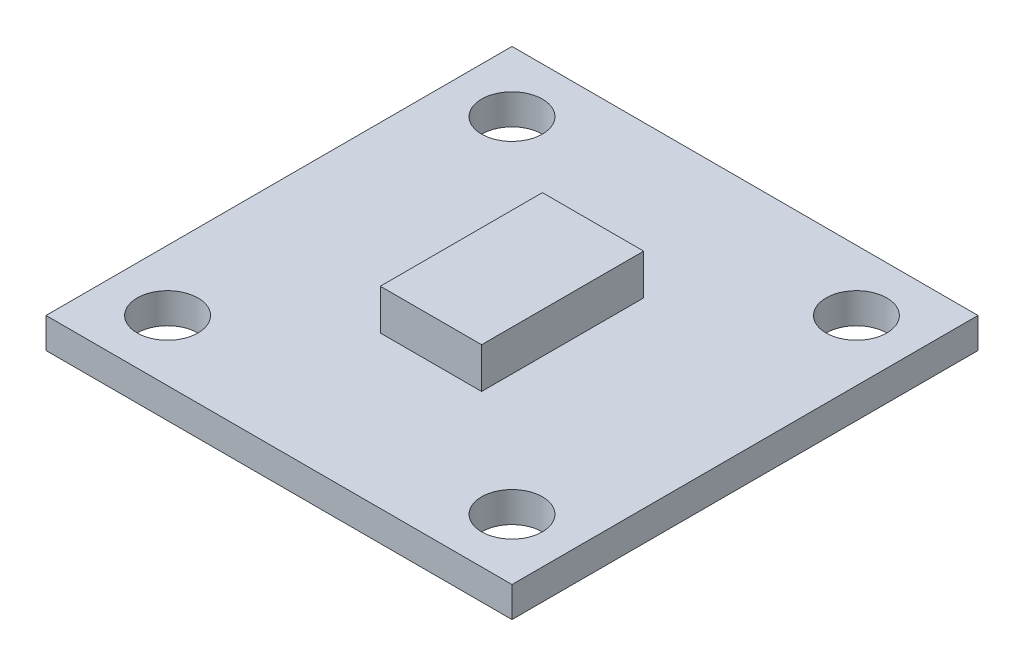
ISO-10303-21;
HEADER;
FILE_DESCRIPTION(('STEP AP214'),'2;1');
FILE_NAME('part.step','',(''),(''),'','','');
FILE_SCHEMA(('AUTOMOTIVE_DESIGN { 1 0 10303 214 1 1 1 1 }'));
ENDSEC;
DATA;
#1=APPLICATION_CONTEXT('core data for automotive mechanical design processes');
#2=APPLICATION_PROTOCOL_DEFINITION('international standard','automotive_design',2000,#1);
#3=PRODUCT_CONTEXT('',#1,'mechanical');
#4=PRODUCT('Part','Part','',(#3));
#5=PRODUCT_RELATED_PRODUCT_CATEGORY('part','',(#4));
#6=PRODUCT_DEFINITION_FORMATION('','',#4);
#7=PRODUCT_DEFINITION_CONTEXT('part definition',#1,'design');
#8=PRODUCT_DEFINITION('design','',#6,#7);
#9=PRODUCT_DEFINITION_SHAPE('','',#8);
#10=(LENGTH_UNIT() NAMED_UNIT(*) SI_UNIT(.MILLI.,.METRE.));
#11=(NAMED_UNIT(*) PLANE_ANGLE_UNIT() SI_UNIT($,.RADIAN.));
#12=(NAMED_UNIT(*) SI_UNIT($,.STERADIAN.) SOLID_ANGLE_UNIT());
#13=UNCERTAINTY_MEASURE_WITH_UNIT(LENGTH_MEASURE(1.E-05),#10,'distance_accuracy_value','');
#14=(GEOMETRIC_REPRESENTATION_CONTEXT(3) GLOBAL_UNCERTAINTY_ASSIGNED_CONTEXT((#13)) GLOBAL_UNIT_ASSIGNED_CONTEXT((#10,
#11,#12)) REPRESENTATION_CONTEXT('',''));
#15=CARTESIAN_POINT('',(0.,0.,0.));
#16=DIRECTION('',(0.,0.,1.));
#17=DIRECTION('',(1.,0.,0.));
#18=AXIS2_PLACEMENT_3D('',#15,#16,#17);
#19=CARTESIAN_POINT('',(0.,1.5,0.));
#20=DIRECTION('',(0.,1.,0.));
#21=DIRECTION('',(0.,0.,1.));
#22=AXIS2_PLACEMENT_3D('',#19,#20,#21);
#23=PLANE('',#22);
#24=CARTESIAN_POINT('',(-8.5,1.5,8.5));
#25=DIRECTION('',(0.,1.,0.));
#26=DIRECTION('',(0.,0.,1.));
#27=AXIS2_PLACEMENT_3D('',#24,#25,#26);
#28=CIRCLE('',#27,1.5);
#29=CARTESIAN_POINT('',(-8.5,1.5,10.));
#30=VERTEX_POINT('',#29);
#31=EDGE_CURVE('E143',#30,#30,#28,.T.);
#32=ORIENTED_EDGE('',*,*,#31,.F.);
#33=EDGE_LOOP('',(#32));
#34=FACE_BOUND('',#33,.T.);
#35=CARTESIAN_POINT('',(8.5,1.5,-8.5));
#36=DIRECTION('',(0.,1.,0.));
#37=DIRECTION('',(0.,0.,1.));
#38=AXIS2_PLACEMENT_3D('',#35,#36,#37);
#39=CIRCLE('',#38,1.5);
#40=CARTESIAN_POINT('',(8.5,1.5,-7.));
#41=VERTEX_POINT('',#40);
#42=EDGE_CURVE('E155',#41,#41,#39,.T.);
#43=ORIENTED_EDGE('',*,*,#42,.F.);
#44=EDGE_LOOP('',(#43));
#45=FACE_BOUND('',#44,.T.);
#46=DIRECTION('',(0.,0.,-1.));
#47=VECTOR('',#46,1.);
#48=CARTESIAN_POINT('',(11.5,1.5,-11.5));
#49=LINE('',#48,#47);
#50=CARTESIAN_POINT('',(11.5,1.5,11.5));
#51=VERTEX_POINT('',#50);
#52=CARTESIAN_POINT('',(11.5,1.5,-11.5));
#53=VERTEX_POINT('',#52);
#54=EDGE_CURVE('E161',#51,#53,#49,.T.);
#55=ORIENTED_EDGE('',*,*,#54,.T.);
#56=DIRECTION('',(-1.,0.,0.));
#57=VECTOR('',#56,1.);
#58=CARTESIAN_POINT('',(-11.5,1.5,-11.5));
#59=LINE('',#58,#57);
#60=CARTESIAN_POINT('',(-11.5,1.5,-11.5));
#61=VERTEX_POINT('',#60);
#62=EDGE_CURVE('E85',#53,#61,#59,.T.);
#63=ORIENTED_EDGE('',*,*,#62,.T.);
#64=DIRECTION('',(0.,0.,1.));
#65=VECTOR('',#64,1.);
#66=CARTESIAN_POINT('',(-11.5,1.5,-11.5));
#67=LINE('',#66,#65);
#68=CARTESIAN_POINT('',(-11.5,1.5,11.5));
#69=VERTEX_POINT('',#68);
#70=EDGE_CURVE('E164',#61,#69,#67,.T.);
#71=ORIENTED_EDGE('',*,*,#70,.T.);
#72=DIRECTION('',(1.,0.,0.));
#73=VECTOR('',#72,1.);
#74=CARTESIAN_POINT('',(-11.5,1.5,11.5));
#75=LINE('',#74,#73);
#76=EDGE_CURVE('E57',#69,#51,#75,.T.);
#77=ORIENTED_EDGE('',*,*,#76,.T.);
#78=EDGE_LOOP('',(#55,#63,#71,#77));
#79=FACE_BOUND('',#78,.T.);
#80=CARTESIAN_POINT('',(8.5,1.5,8.5));
#81=DIRECTION('',(0.,1.,0.));
#82=DIRECTION('',(0.,0.,-1.));
#83=AXIS2_PLACEMENT_3D('',#80,#81,#82);
#84=CIRCLE('',#83,1.5);
#85=CARTESIAN_POINT('',(8.5,1.5,7.));
#86=VERTEX_POINT('',#85);
#87=EDGE_CURVE('E149',#86,#86,#84,.T.);
#88=ORIENTED_EDGE('',*,*,#87,.F.);
#89=EDGE_LOOP('',(#88));
#90=FACE_BOUND('',#89,.T.);
#91=CARTESIAN_POINT('',(-8.5,1.5,-8.5));
#92=DIRECTION('',(0.,1.,0.));
#93=DIRECTION('',(0.,0.,-1.));
#94=AXIS2_PLACEMENT_3D('',#91,#92,#93);
#95=CIRCLE('',#94,1.5);
#96=CARTESIAN_POINT('',(-8.5,1.5,-10.));
#97=VERTEX_POINT('',#96);
#98=EDGE_CURVE('E135',#97,#97,#95,.T.);
#99=ORIENTED_EDGE('',*,*,#98,.F.);
#100=EDGE_LOOP('',(#99));
#101=FACE_BOUND('',#100,.T.);
#102=DIRECTION('',(-1.,0.,0.));
#103=VECTOR('',#102,1.);
#104=CARTESIAN_POINT('',(-2.5,1.5,-4.));
#105=LINE('',#104,#103);
#106=CARTESIAN_POINT('',(2.5,1.5,-4.));
#107=VERTEX_POINT('',#106);
#108=CARTESIAN_POINT('',(-2.5,1.5,-4.));
#109=VERTEX_POINT('',#108);
#110=EDGE_CURVE('E331',#107,#109,#105,.T.);
#111=ORIENTED_EDGE('',*,*,#110,.F.);
#112=DIRECTION('',(0.,0.,-1.));
#113=VECTOR('',#112,1.);
#114=CARTESIAN_POINT('',(2.5,1.5,-4.));
#115=LINE('',#114,#113);
#116=CARTESIAN_POINT('',(2.5,1.5,4.));
#117=VERTEX_POINT('',#116);
#118=EDGE_CURVE('E130',#117,#107,#115,.T.);
#119=ORIENTED_EDGE('',*,*,#118,.F.);
#120=DIRECTION('',(1.,0.,0.));
#121=VECTOR('',#120,1.);
#122=CARTESIAN_POINT('',(-2.5,1.5,4.));
#123=LINE('',#122,#121);
#124=CARTESIAN_POINT('',(-2.5,1.5,4.));
#125=VERTEX_POINT('',#124);
#126=EDGE_CURVE('E126',#125,#117,#123,.T.);
#127=ORIENTED_EDGE('',*,*,#126,.F.);
#128=DIRECTION('',(0.,0.,1.));
#129=VECTOR('',#128,1.);
#130=CARTESIAN_POINT('',(-2.5,1.5,-4.));
#131=LINE('',#130,#129);
#132=EDGE_CURVE('E328',#109,#125,#131,.T.);
#133=ORIENTED_EDGE('',*,*,#132,.F.);
#134=EDGE_LOOP('',(#111,#119,#127,#133));
#135=FACE_BOUND('',#134,.T.);
#136=ADVANCED_FACE('F33',(#34,#45,#79,#90,#101,#135),#23,.T.);
#137=CARTESIAN_POINT('',(0.,0.,0.));
#138=DIRECTION('',(0.,1.,0.));
#139=DIRECTION('',(0.,0.,1.));
#140=AXIS2_PLACEMENT_3D('',#137,#138,#139);
#141=PLANE('',#140);
#142=DIRECTION('',(0.,0.,-1.));
#143=VECTOR('',#142,1.);
#144=CARTESIAN_POINT('',(11.5,0.,-11.5));
#145=LINE('',#144,#143);
#146=CARTESIAN_POINT('',(11.5,0.,11.5));
#147=VERTEX_POINT('',#146);
#148=CARTESIAN_POINT('',(11.5,0.,-11.5));
#149=VERTEX_POINT('',#148);
#150=EDGE_CURVE('E158',#147,#149,#145,.T.);
#151=ORIENTED_EDGE('',*,*,#150,.F.);
#152=DIRECTION('',(1.,0.,0.));
#153=VECTOR('',#152,1.);
#154=CARTESIAN_POINT('',(-11.5,0.,11.5));
#155=LINE('',#154,#153);
#156=CARTESIAN_POINT('',(-11.5,0.,11.5));
#157=VERTEX_POINT('',#156);
#158=EDGE_CURVE('E78',#157,#147,#155,.T.);
#159=ORIENTED_EDGE('',*,*,#158,.F.);
#160=DIRECTION('',(0.,0.,1.));
#161=VECTOR('',#160,1.);
#162=CARTESIAN_POINT('',(-11.5,0.,-11.5));
#163=LINE('',#162,#161);
#164=CARTESIAN_POINT('',(-11.5,0.,-11.5));
#165=VERTEX_POINT('',#164);
#166=EDGE_CURVE('E172',#165,#157,#163,.T.);
#167=ORIENTED_EDGE('',*,*,#166,.F.);
#168=DIRECTION('',(-1.,0.,0.));
#169=VECTOR('',#168,1.);
#170=CARTESIAN_POINT('',(-11.5,0.,-11.5));
#171=LINE('',#170,#169);
#172=EDGE_CURVE('E170',#149,#165,#171,.T.);
#173=ORIENTED_EDGE('',*,*,#172,.F.);
#174=EDGE_LOOP('',(#151,#159,#167,#173));
#175=FACE_BOUND('',#174,.T.);
#176=CARTESIAN_POINT('',(8.5,0.,-8.5));
#177=DIRECTION('',(0.,1.,0.));
#178=DIRECTION('',(0.,0.,1.));
#179=AXIS2_PLACEMENT_3D('',#176,#177,#178);
#180=CIRCLE('',#179,1.5);
#181=CARTESIAN_POINT('',(8.5,0.,-7.));
#182=VERTEX_POINT('',#181);
#183=EDGE_CURVE('E152',#182,#182,#180,.T.);
#184=ORIENTED_EDGE('',*,*,#183,.T.);
#185=EDGE_LOOP('',(#184));
#186=FACE_BOUND('',#185,.T.);
#187=CARTESIAN_POINT('',(8.5,0.,8.5));
#188=DIRECTION('',(0.,1.,0.));
#189=DIRECTION('',(0.,0.,-1.));
#190=AXIS2_PLACEMENT_3D('',#187,#188,#189);
#191=CIRCLE('',#190,1.5);
#192=CARTESIAN_POINT('',(8.5,0.,7.));
#193=VERTEX_POINT('',#192);
#194=EDGE_CURVE('E146',#193,#193,#191,.T.);
#195=ORIENTED_EDGE('',*,*,#194,.T.);
#196=EDGE_LOOP('',(#195));
#197=FACE_BOUND('',#196,.T.);
#198=CARTESIAN_POINT('',(-8.5,0.,8.5));
#199=DIRECTION('',(0.,1.,0.));
#200=DIRECTION('',(0.,0.,1.));
#201=AXIS2_PLACEMENT_3D('',#198,#199,#200);
#202=CIRCLE('',#201,1.5);
#203=CARTESIAN_POINT('',(-8.5,0.,10.));
#204=VERTEX_POINT('',#203);
#205=EDGE_CURVE('E141',#204,#204,#202,.T.);
#206=ORIENTED_EDGE('',*,*,#205,.T.);
#207=EDGE_LOOP('',(#206));
#208=FACE_BOUND('',#207,.T.);
#209=CARTESIAN_POINT('',(-8.5,0.,-8.5));
#210=DIRECTION('',(0.,1.,0.));
#211=DIRECTION('',(0.,0.,-1.));
#212=AXIS2_PLACEMENT_3D('',#209,#210,#211);
#213=CIRCLE('',#212,1.5);
#214=CARTESIAN_POINT('',(-8.5,0.,-10.));
#215=VERTEX_POINT('',#214);
#216=EDGE_CURVE('E132',#215,#215,#213,.T.);
#217=ORIENTED_EDGE('',*,*,#216,.T.);
#218=EDGE_LOOP('',(#217));
#219=FACE_BOUND('',#218,.T.);
#220=ADVANCED_FACE('F185',(#175,#186,#197,#208,#219),#141,.F.);
#221=CARTESIAN_POINT('',(11.5,1.5,-11.5));
#222=DIRECTION('',(-1.,0.,0.));
#223=DIRECTION('',(0.,0.,1.));
#224=AXIS2_PLACEMENT_3D('',#221,#222,#223);
#225=PLANE('',#224);
#226=ORIENTED_EDGE('',*,*,#150,.T.);
#227=DIRECTION('',(0.,-1.,0.));
#228=VECTOR('',#227,1.);
#229=CARTESIAN_POINT('',(11.5,1.5,-11.5));
#230=LINE('',#229,#228);
#231=EDGE_CURVE('E11',#53,#149,#230,.T.);
#232=ORIENTED_EDGE('',*,*,#231,.F.);
#233=ORIENTED_EDGE('',*,*,#54,.F.);
#234=DIRECTION('',(0.,-1.,0.));
#235=VECTOR('',#234,1.);
#236=CARTESIAN_POINT('',(11.5,1.5,11.5));
#237=LINE('',#236,#235);
#238=EDGE_CURVE('E167',#51,#147,#237,.T.);
#239=ORIENTED_EDGE('',*,*,#238,.T.);
#240=EDGE_LOOP('',(#226,#232,#233,#239));
#241=FACE_BOUND('',#240,.T.);
#242=ADVANCED_FACE('F35',(#241),#225,.F.);
#243=CARTESIAN_POINT('',(-11.5,1.5,-11.5));
#244=DIRECTION('',(0.,0.,1.));
#245=DIRECTION('',(1.,0.,0.));
#246=AXIS2_PLACEMENT_3D('',#243,#244,#245);
#247=PLANE('',#246);
#248=ORIENTED_EDGE('',*,*,#172,.T.);
#249=DIRECTION('',(0.,-1.,0.));
#250=VECTOR('',#249,1.);
#251=CARTESIAN_POINT('',(-11.5,1.5,-11.5));
#252=LINE('',#251,#250);
#253=EDGE_CURVE('E41',#61,#165,#252,.T.);
#254=ORIENTED_EDGE('',*,*,#253,.F.);
#255=ORIENTED_EDGE('',*,*,#62,.F.);
#256=ORIENTED_EDGE('',*,*,#231,.T.);
#257=EDGE_LOOP('',(#248,#254,#255,#256));
#258=FACE_BOUND('',#257,.T.);
#259=ADVANCED_FACE('F201',(#258),#247,.F.);
#260=CARTESIAN_POINT('',(-11.5,1.5,-11.5));
#261=DIRECTION('',(1.,0.,0.));
#262=DIRECTION('',(0.,0.,-1.));
#263=AXIS2_PLACEMENT_3D('',#260,#261,#262);
#264=PLANE('',#263);
#265=ORIENTED_EDGE('',*,*,#166,.T.);
#266=DIRECTION('',(0.,-1.,0.));
#267=VECTOR('',#266,1.);
#268=CARTESIAN_POINT('',(-11.5,1.5,11.5));
#269=LINE('',#268,#267);
#270=EDGE_CURVE('E176',#69,#157,#269,.T.);
#271=ORIENTED_EDGE('',*,*,#270,.F.);
#272=ORIENTED_EDGE('',*,*,#70,.F.);
#273=ORIENTED_EDGE('',*,*,#253,.T.);
#274=EDGE_LOOP('',(#265,#271,#272,#273));
#275=FACE_BOUND('',#274,.T.);
#276=ADVANCED_FACE('F181',(#275),#264,.F.);
#277=CARTESIAN_POINT('',(-11.5,1.5,11.5));
#278=DIRECTION('',(0.,0.,-1.));
#279=DIRECTION('',(-1.,0.,0.));
#280=AXIS2_PLACEMENT_3D('',#277,#278,#279);
#281=PLANE('',#280);
#282=ORIENTED_EDGE('',*,*,#158,.T.);
#283=ORIENTED_EDGE('',*,*,#238,.F.);
#284=ORIENTED_EDGE('',*,*,#76,.F.);
#285=ORIENTED_EDGE('',*,*,#270,.T.);
#286=EDGE_LOOP('',(#282,#283,#284,#285));
#287=FACE_BOUND('',#286,.T.);
#288=ADVANCED_FACE('F190',(#287),#281,.F.);
#289=CARTESIAN_POINT('',(8.5,1.5,-8.5));
#290=DIRECTION('',(0.,-1.,0.));
#291=DIRECTION('',(0.,0.,-1.));
#292=AXIS2_PLACEMENT_3D('',#289,#290,#291);
#293=CYLINDRICAL_SURFACE('',#292,1.5);
#294=ORIENTED_EDGE('',*,*,#42,.T.);
#295=EDGE_LOOP('',(#294));
#296=FACE_BOUND('',#295,.T.);
#297=ORIENTED_EDGE('',*,*,#183,.F.);
#298=EDGE_LOOP('',(#297));
#299=FACE_BOUND('',#298,.T.);
#300=ADVANCED_FACE('F192',(#296,#299),#293,.F.);
#301=CARTESIAN_POINT('',(8.5,1.5,8.5));
#302=DIRECTION('',(0.,-1.,0.));
#303=DIRECTION('',(0.,0.,-1.));
#304=AXIS2_PLACEMENT_3D('',#301,#302,#303);
#305=CYLINDRICAL_SURFACE('',#304,1.5);
#306=ORIENTED_EDGE('',*,*,#87,.T.);
#307=EDGE_LOOP('',(#306));
#308=FACE_BOUND('',#307,.T.);
#309=ORIENTED_EDGE('',*,*,#194,.F.);
#310=EDGE_LOOP('',(#309));
#311=FACE_BOUND('',#310,.T.);
#312=ADVANCED_FACE('F198',(#308,#311),#305,.F.);
#313=CARTESIAN_POINT('',(-8.5,1.5,8.5));
#314=DIRECTION('',(0.,-1.,0.));
#315=DIRECTION('',(0.,0.,-1.));
#316=AXIS2_PLACEMENT_3D('',#313,#314,#315);
#317=CYLINDRICAL_SURFACE('',#316,1.5);
#318=ORIENTED_EDGE('',*,*,#31,.T.);
#319=EDGE_LOOP('',(#318));
#320=FACE_BOUND('',#319,.T.);
#321=ORIENTED_EDGE('',*,*,#205,.F.);
#322=EDGE_LOOP('',(#321));
#323=FACE_BOUND('',#322,.T.);
#324=ADVANCED_FACE('F215',(#320,#323),#317,.F.);
#325=CARTESIAN_POINT('',(-8.5,1.5,-8.5));
#326=DIRECTION('',(0.,-1.,0.));
#327=DIRECTION('',(0.,0.,-1.));
#328=AXIS2_PLACEMENT_3D('',#325,#326,#327);
#329=CYLINDRICAL_SURFACE('',#328,1.5);
#330=ORIENTED_EDGE('',*,*,#98,.T.);
#331=EDGE_LOOP('',(#330));
#332=FACE_BOUND('',#331,.T.);
#333=ORIENTED_EDGE('',*,*,#216,.F.);
#334=EDGE_LOOP('',(#333));
#335=FACE_BOUND('',#334,.T.);
#336=ADVANCED_FACE('F219',(#332,#335),#329,.F.);
#337=CARTESIAN_POINT('',(2.5,3.5,-4.));
#338=DIRECTION('',(-1.,0.,0.));
#339=DIRECTION('',(0.,0.,1.));
#340=AXIS2_PLACEMENT_3D('',#337,#338,#339);
#341=PLANE('',#340);
#342=ORIENTED_EDGE('',*,*,#118,.T.);
#343=DIRECTION('',(0.,-1.,0.));
#344=VECTOR('',#343,1.);
#345=CARTESIAN_POINT('',(2.5,3.5,-4.));
#346=LINE('',#345,#344);
#347=CARTESIAN_POINT('',(2.5,3.5,-4.));
#348=VERTEX_POINT('',#347);
#349=EDGE_CURVE('E111',#348,#107,#346,.T.);
#350=ORIENTED_EDGE('',*,*,#349,.F.);
#351=DIRECTION('',(0.,0.,-1.));
#352=VECTOR('',#351,1.);
#353=CARTESIAN_POINT('',(2.5,3.5,-4.));
#354=LINE('',#353,#352);
#355=CARTESIAN_POINT('',(2.5,3.5,4.));
#356=VERTEX_POINT('',#355);
#357=EDGE_CURVE('E118',#356,#348,#354,.T.);
#358=ORIENTED_EDGE('',*,*,#357,.F.);
#359=DIRECTION('',(0.,-1.,0.));
#360=VECTOR('',#359,1.);
#361=CARTESIAN_POINT('',(2.5,3.5,4.));
#362=LINE('',#361,#360);
#363=EDGE_CURVE('E325',#356,#117,#362,.T.);
#364=ORIENTED_EDGE('',*,*,#363,.T.);
#365=EDGE_LOOP('',(#342,#350,#358,#364));
#366=FACE_BOUND('',#365,.T.);
#367=ADVANCED_FACE('F128',(#366),#341,.F.);
#368=CARTESIAN_POINT('',(-2.5,3.5,-4.));
#369=DIRECTION('',(0.,0.,1.));
#370=DIRECTION('',(1.,0.,0.));
#371=AXIS2_PLACEMENT_3D('',#368,#369,#370);
#372=PLANE('',#371);
#373=ORIENTED_EDGE('',*,*,#110,.T.);
#374=DIRECTION('',(0.,-1.,0.));
#375=VECTOR('',#374,1.);
#376=CARTESIAN_POINT('',(-2.5,3.5,-4.));
#377=LINE('',#376,#375);
#378=CARTESIAN_POINT('',(-2.5,3.5,-4.));
#379=VERTEX_POINT('',#378);
#380=EDGE_CURVE('E114',#379,#109,#377,.T.);
#381=ORIENTED_EDGE('',*,*,#380,.F.);
#382=DIRECTION('',(-1.,0.,0.));
#383=VECTOR('',#382,1.);
#384=CARTESIAN_POINT('',(-2.5,3.5,-4.));
#385=LINE('',#384,#383);
#386=EDGE_CURVE('E107',#348,#379,#385,.T.);
#387=ORIENTED_EDGE('',*,*,#386,.F.);
#388=ORIENTED_EDGE('',*,*,#349,.T.);
#389=EDGE_LOOP('',(#373,#381,#387,#388));
#390=FACE_BOUND('',#389,.T.);
#391=ADVANCED_FACE('F109',(#390),#372,.F.);
#392=CARTESIAN_POINT('',(-2.5,3.5,-4.));
#393=DIRECTION('',(1.,0.,0.));
#394=DIRECTION('',(0.,0.,-1.));
#395=AXIS2_PLACEMENT_3D('',#392,#393,#394);
#396=PLANE('',#395);
#397=ORIENTED_EDGE('',*,*,#132,.T.);
#398=DIRECTION('',(0.,-1.,0.));
#399=VECTOR('',#398,1.);
#400=CARTESIAN_POINT('',(-2.5,3.5,4.));
#401=LINE('',#400,#399);
#402=CARTESIAN_POINT('',(-2.5,3.5,4.));
#403=VERTEX_POINT('',#402);
#404=EDGE_CURVE('E48',#403,#125,#401,.T.);
#405=ORIENTED_EDGE('',*,*,#404,.F.);
#406=DIRECTION('',(0.,0.,1.));
#407=VECTOR('',#406,1.);
#408=CARTESIAN_POINT('',(-2.5,3.5,-4.));
#409=LINE('',#408,#407);
#410=EDGE_CURVE('E117',#379,#403,#409,.T.);
#411=ORIENTED_EDGE('',*,*,#410,.F.);
#412=ORIENTED_EDGE('',*,*,#380,.T.);
#413=EDGE_LOOP('',(#397,#405,#411,#412));
#414=FACE_BOUND('',#413,.T.);
#415=ADVANCED_FACE('F228',(#414),#396,.F.);
#416=CARTESIAN_POINT('',(-2.5,3.5,4.));
#417=DIRECTION('',(0.,0.,-1.));
#418=DIRECTION('',(-1.,0.,0.));
#419=AXIS2_PLACEMENT_3D('',#416,#417,#418);
#420=PLANE('',#419);
#421=ORIENTED_EDGE('',*,*,#126,.T.);
#422=ORIENTED_EDGE('',*,*,#363,.F.);
#423=DIRECTION('',(1.,0.,0.));
#424=VECTOR('',#423,1.);
#425=CARTESIAN_POINT('',(-2.5,3.5,4.));
#426=LINE('',#425,#424);
#427=EDGE_CURVE('E122',#403,#356,#426,.T.);
#428=ORIENTED_EDGE('',*,*,#427,.F.);
#429=ORIENTED_EDGE('',*,*,#404,.T.);
#430=EDGE_LOOP('',(#421,#422,#428,#429));
#431=FACE_BOUND('',#430,.T.);
#432=ADVANCED_FACE('F231',(#431),#420,.F.);
#433=CARTESIAN_POINT('',(0.,3.5,0.));
#434=DIRECTION('',(0.,1.,0.));
#435=DIRECTION('',(0.,0.,1.));
#436=AXIS2_PLACEMENT_3D('',#433,#434,#435);
#437=PLANE('',#436);
#438=ORIENTED_EDGE('',*,*,#357,.T.);
#439=ORIENTED_EDGE('',*,*,#386,.T.);
#440=ORIENTED_EDGE('',*,*,#410,.T.);
#441=ORIENTED_EDGE('',*,*,#427,.T.);
#442=EDGE_LOOP('',(#438,#439,#440,#441));
#443=FACE_BOUND('',#442,.T.);
#444=ADVANCED_FACE('F121',(#443),#437,.T.);
#445=CLOSED_SHELL('',(#136,#220,#242,#259,#276,#288,#300,#312,#324,#336,#367,#391,#415,#432,#444));
#446=MANIFOLD_SOLID_BREP('B2',#445);
#447=ADVANCED_BREP_SHAPE_REPRESENTATION('',(#18,#446),#14);
#448=SHAPE_DEFINITION_REPRESENTATION(#9,#447);
ENDSEC;
END-ISO-10303-21;
